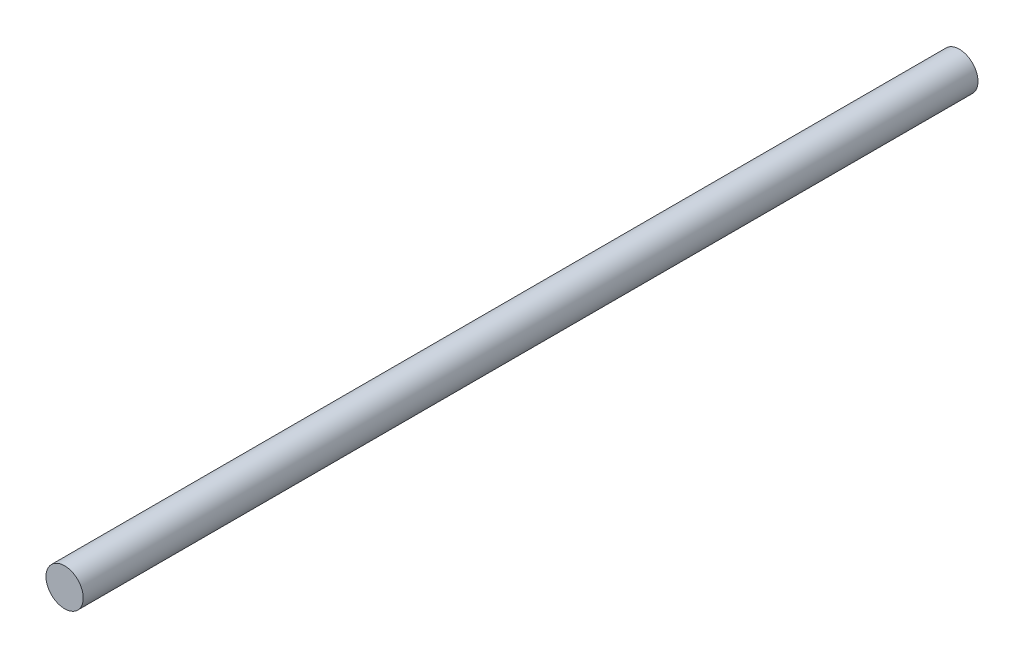
ISO-10303-21;
HEADER;
FILE_DESCRIPTION(('STEP AP214'),'2;1');
FILE_NAME('part.step','',(''),(''),'','','');
FILE_SCHEMA(('AUTOMOTIVE_DESIGN { 1 0 10303 214 1 1 1 1 }'));
ENDSEC;
DATA;
#1=APPLICATION_CONTEXT('core data for automotive mechanical design processes');
#2=APPLICATION_PROTOCOL_DEFINITION('international standard','automotive_design',2000,#1);
#3=PRODUCT_CONTEXT('',#1,'mechanical');
#4=PRODUCT('Part','Part','',(#3));
#5=PRODUCT_RELATED_PRODUCT_CATEGORY('part','',(#4));
#6=PRODUCT_DEFINITION_FORMATION('','',#4);
#7=PRODUCT_DEFINITION_CONTEXT('part definition',#1,'design');
#8=PRODUCT_DEFINITION('design','',#6,#7);
#9=PRODUCT_DEFINITION_SHAPE('','',#8);
#10=(LENGTH_UNIT() NAMED_UNIT(*) SI_UNIT(.MILLI.,.METRE.));
#11=(NAMED_UNIT(*) PLANE_ANGLE_UNIT() SI_UNIT($,.RADIAN.));
#12=(NAMED_UNIT(*) SI_UNIT($,.STERADIAN.) SOLID_ANGLE_UNIT());
#13=UNCERTAINTY_MEASURE_WITH_UNIT(LENGTH_MEASURE(1.E-05),#10,'distance_accuracy_value','');
#14=(GEOMETRIC_REPRESENTATION_CONTEXT(3) GLOBAL_UNCERTAINTY_ASSIGNED_CONTEXT((#13)) GLOBAL_UNIT_ASSIGNED_CONTEXT((#10,
#11,#12)) REPRESENTATION_CONTEXT('',''));
#15=CARTESIAN_POINT('',(0.,0.,0.));
#16=DIRECTION('',(0.,0.,1.));
#17=DIRECTION('',(1.,0.,0.));
#18=AXIS2_PLACEMENT_3D('',#15,#16,#17);
#19=CARTESIAN_POINT('',(0.,0.,240.));
#20=DIRECTION('',(0.,0.,-1.));
#21=DIRECTION('',(-1.,0.,0.));
#22=AXIS2_PLACEMENT_3D('',#19,#20,#21);
#23=CYLINDRICAL_SURFACE('',#22,5.);
#24=CARTESIAN_POINT('',(0.,0.,240.));
#25=DIRECTION('',(0.,0.,1.));
#26=DIRECTION('',(1.,0.,0.));
#27=AXIS2_PLACEMENT_3D('',#24,#25,#26);
#28=CIRCLE('',#27,5.);
#29=CARTESIAN_POINT('',(5.,0.,240.));
#30=VERTEX_POINT('',#29);
#31=EDGE_CURVE('E10',#30,#30,#28,.T.);
#32=ORIENTED_EDGE('',*,*,#31,.F.);
#33=EDGE_LOOP('',(#32));
#34=FACE_BOUND('',#33,.T.);
#35=CARTESIAN_POINT('',(0.,0.,0.));
#36=DIRECTION('',(0.,0.,1.));
#37=DIRECTION('',(1.,0.,0.));
#38=AXIS2_PLACEMENT_3D('',#35,#36,#37);
#39=CIRCLE('',#38,5.);
#40=CARTESIAN_POINT('',(5.,0.,0.));
#41=VERTEX_POINT('',#40);
#42=EDGE_CURVE('E40',#41,#41,#39,.T.);
#43=ORIENTED_EDGE('',*,*,#42,.T.);
#44=EDGE_LOOP('',(#43));
#45=FACE_BOUND('',#44,.T.);
#46=ADVANCED_FACE('F37',(#34,#45),#23,.T.);
#47=CARTESIAN_POINT('',(0.,0.,240.));
#48=DIRECTION('',(0.,0.,1.));
#49=DIRECTION('',(1.,0.,0.));
#50=AXIS2_PLACEMENT_3D('',#47,#48,#49);
#51=PLANE('',#50);
#52=ORIENTED_EDGE('',*,*,#31,.T.);
#53=EDGE_LOOP('',(#52));
#54=FACE_BOUND('',#53,.T.);
#55=ADVANCED_FACE('F52',(#54),#51,.T.);
#56=CARTESIAN_POINT('',(0.,0.,0.));
#57=DIRECTION('',(0.,0.,1.));
#58=DIRECTION('',(1.,0.,0.));
#59=AXIS2_PLACEMENT_3D('',#56,#57,#58);
#60=PLANE('',#59);
#61=ORIENTED_EDGE('',*,*,#42,.F.);
#62=EDGE_LOOP('',(#61));
#63=FACE_BOUND('',#62,.T.);
#64=ADVANCED_FACE('F50',(#63),#60,.F.);
#65=CLOSED_SHELL('',(#46,#55,#64));
#66=MANIFOLD_SOLID_BREP('B2',#65);
#67=ADVANCED_BREP_SHAPE_REPRESENTATION('',(#18,#66),#14);
#68=SHAPE_DEFINITION_REPRESENTATION(#9,#67);
ENDSEC;
END-ISO-10303-21;
